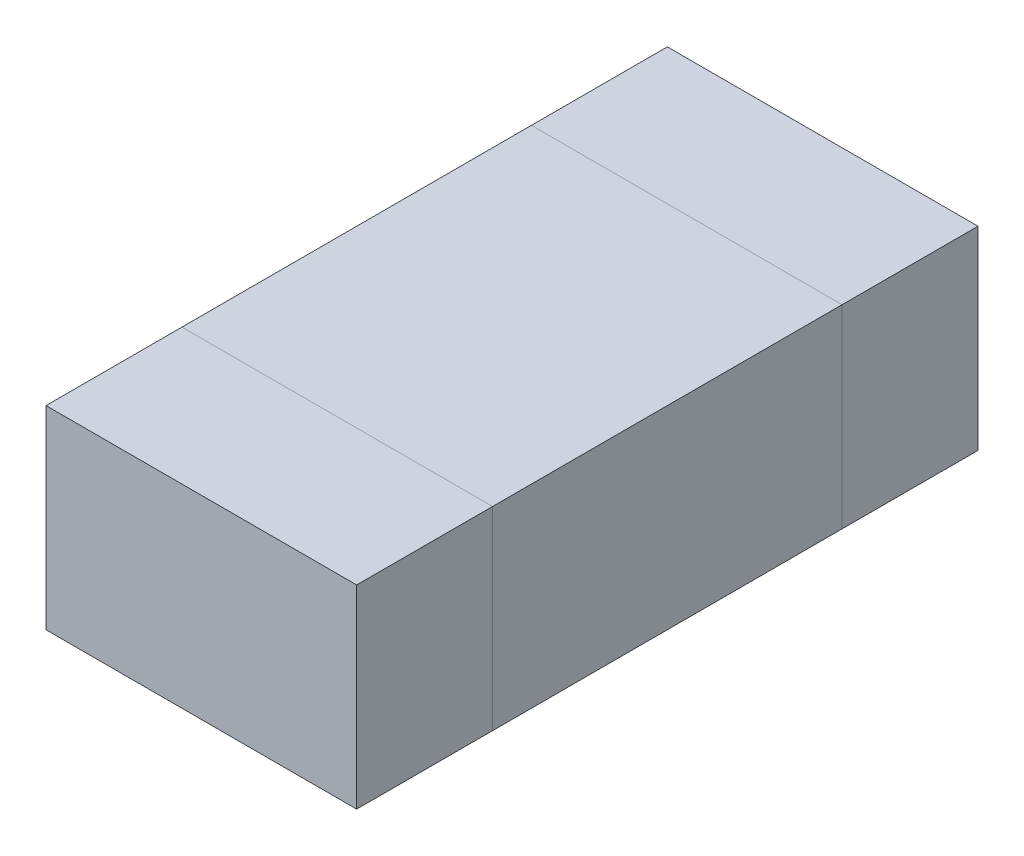
ISO-10303-21;
HEADER;
FILE_DESCRIPTION(('STEP AP214'),'2;1');
FILE_NAME('part.step','',(''),(''),'','','');
FILE_SCHEMA(('AUTOMOTIVE_DESIGN { 1 0 10303 214 1 1 1 1 }'));
ENDSEC;
DATA;
#1=APPLICATION_CONTEXT('core data for automotive mechanical design processes');
#2=APPLICATION_PROTOCOL_DEFINITION('international standard','automotive_design',2000,#1);
#3=PRODUCT_CONTEXT('',#1,'mechanical');
#4=PRODUCT('Part','Part','',(#3));
#5=PRODUCT_RELATED_PRODUCT_CATEGORY('part','',(#4));
#6=PRODUCT_DEFINITION_FORMATION('','',#4);
#7=PRODUCT_DEFINITION_CONTEXT('part definition',#1,'design');
#8=PRODUCT_DEFINITION('design','',#6,#7);
#9=PRODUCT_DEFINITION_SHAPE('','',#8);
#10=(LENGTH_UNIT() NAMED_UNIT(*) SI_UNIT(.MILLI.,.METRE.));
#11=(NAMED_UNIT(*) PLANE_ANGLE_UNIT() SI_UNIT($,.RADIAN.));
#12=(NAMED_UNIT(*) SI_UNIT($,.STERADIAN.) SOLID_ANGLE_UNIT());
#13=UNCERTAINTY_MEASURE_WITH_UNIT(LENGTH_MEASURE(1.E-05),#10,'distance_accuracy_value','');
#14=(GEOMETRIC_REPRESENTATION_CONTEXT(3) GLOBAL_UNCERTAINTY_ASSIGNED_CONTEXT((#13)) GLOBAL_UNIT_ASSIGNED_CONTEXT((#10,
#11,#12)) REPRESENTATION_CONTEXT('',''));
#15=CARTESIAN_POINT('',(0.,0.,0.));
#16=DIRECTION('',(0.,0.,1.));
#17=DIRECTION('',(1.,0.,0.));
#18=AXIS2_PLACEMENT_3D('',#15,#16,#17);
#19=CARTESIAN_POINT('',(0.8,1.,-1.6));
#20=DIRECTION('',(-1.,0.,0.));
#21=DIRECTION('',(0.,0.,1.));
#22=AXIS2_PLACEMENT_3D('',#19,#20,#21);
#23=PLANE('',#22);
#24=DIRECTION('',(0.,-1.,0.));
#25=VECTOR('',#24,1.);
#26=CARTESIAN_POINT('',(0.8,1.,-0.9));
#27=LINE('',#26,#25);
#28=CARTESIAN_POINT('',(0.8,1.,-0.9));
#29=VERTEX_POINT('',#28);
#30=CARTESIAN_POINT('',(0.8,0.,-0.9));
#31=VERTEX_POINT('',#30);
#32=EDGE_CURVE('E107',#29,#31,#27,.T.);
#33=ORIENTED_EDGE('',*,*,#32,.T.);
#34=DIRECTION('',(0.,0.,1.));
#35=VECTOR('',#34,1.);
#36=CARTESIAN_POINT('',(0.8,0.,-1.6));
#37=LINE('',#36,#35);
#38=CARTESIAN_POINT('',(0.8,0.,-1.6));
#39=VERTEX_POINT('',#38);
#40=EDGE_CURVE('E12',#39,#31,#37,.T.);
#41=ORIENTED_EDGE('',*,*,#40,.F.);
#42=DIRECTION('',(0.,-1.,0.));
#43=VECTOR('',#42,1.);
#44=CARTESIAN_POINT('',(0.8,1.,-1.6));
#45=LINE('',#44,#43);
#46=CARTESIAN_POINT('',(0.8,1.,-1.6));
#47=VERTEX_POINT('',#46);
#48=EDGE_CURVE('E95',#47,#39,#45,.T.);
#49=ORIENTED_EDGE('',*,*,#48,.F.);
#50=DIRECTION('',(0.,0.,1.));
#51=VECTOR('',#50,1.);
#52=CARTESIAN_POINT('',(0.8,1.,-1.6));
#53=LINE('',#52,#51);
#54=EDGE_CURVE('E103',#47,#29,#53,.T.);
#55=ORIENTED_EDGE('',*,*,#54,.T.);
#56=EDGE_LOOP('',(#33,#41,#49,#55));
#57=FACE_BOUND('',#56,.T.);
#58=ADVANCED_FACE('F44',(#57),#23,.F.);
#59=CARTESIAN_POINT('',(0.8,0.,-1.6));
#60=DIRECTION('',(0.,1.,0.));
#61=DIRECTION('',(0.,0.,1.));
#62=AXIS2_PLACEMENT_3D('',#59,#60,#61);
#63=PLANE('',#62);
#64=DIRECTION('',(-1.,0.,0.));
#65=VECTOR('',#64,1.);
#66=CARTESIAN_POINT('',(0.8,0.,-0.9));
#67=LINE('',#66,#65);
#68=CARTESIAN_POINT('',(-0.8,0.,-0.9));
#69=VERTEX_POINT('',#68);
#70=EDGE_CURVE('E99',#31,#69,#67,.T.);
#71=ORIENTED_EDGE('',*,*,#70,.T.);
#72=DIRECTION('',(0.,0.,1.));
#73=VECTOR('',#72,1.);
#74=CARTESIAN_POINT('',(-0.8,0.,-1.6));
#75=LINE('',#74,#73);
#76=CARTESIAN_POINT('',(-0.8,0.,-1.6));
#77=VERTEX_POINT('',#76);
#78=EDGE_CURVE('E52',#77,#69,#75,.T.);
#79=ORIENTED_EDGE('',*,*,#78,.F.);
#80=DIRECTION('',(-1.,0.,0.));
#81=VECTOR('',#80,1.);
#82=CARTESIAN_POINT('',(0.8,0.,-1.6));
#83=LINE('',#82,#81);
#84=EDGE_CURVE('E90',#39,#77,#83,.T.);
#85=ORIENTED_EDGE('',*,*,#84,.F.);
#86=ORIENTED_EDGE('',*,*,#40,.T.);
#87=EDGE_LOOP('',(#71,#79,#85,#86));
#88=FACE_BOUND('',#87,.T.);
#89=ADVANCED_FACE('F98',(#88),#63,.F.);
#90=CARTESIAN_POINT('',(-0.8,0.,-1.6));
#91=DIRECTION('',(1.,0.,0.));
#92=DIRECTION('',(0.,0.,-1.));
#93=AXIS2_PLACEMENT_3D('',#90,#91,#92);
#94=PLANE('',#93);
#95=DIRECTION('',(0.,1.,0.));
#96=VECTOR('',#95,1.);
#97=CARTESIAN_POINT('',(-0.8,0.,-0.9));
#98=LINE('',#97,#96);
#99=CARTESIAN_POINT('',(-0.8,1.,-0.9));
#100=VERTEX_POINT('',#99);
#101=EDGE_CURVE('E77',#69,#100,#98,.T.);
#102=ORIENTED_EDGE('',*,*,#101,.T.);
#103=DIRECTION('',(0.,0.,1.));
#104=VECTOR('',#103,1.);
#105=CARTESIAN_POINT('',(-0.8,1.,-1.6));
#106=LINE('',#105,#104);
#107=CARTESIAN_POINT('',(-0.8,1.,-1.6));
#108=VERTEX_POINT('',#107);
#109=EDGE_CURVE('E100',#108,#100,#106,.T.);
#110=ORIENTED_EDGE('',*,*,#109,.F.);
#111=DIRECTION('',(0.,1.,0.));
#112=VECTOR('',#111,1.);
#113=CARTESIAN_POINT('',(-0.8,0.,-1.6));
#114=LINE('',#113,#112);
#115=EDGE_CURVE('E93',#77,#108,#114,.T.);
#116=ORIENTED_EDGE('',*,*,#115,.F.);
#117=ORIENTED_EDGE('',*,*,#78,.T.);
#118=EDGE_LOOP('',(#102,#110,#116,#117));
#119=FACE_BOUND('',#118,.T.);
#120=ADVANCED_FACE('F101',(#119),#94,.F.);
#121=CARTESIAN_POINT('',(-0.8,1.,-1.6));
#122=DIRECTION('',(0.,-1.,0.));
#123=DIRECTION('',(0.,0.,-1.));
#124=AXIS2_PLACEMENT_3D('',#121,#122,#123);
#125=PLANE('',#124);
#126=DIRECTION('',(1.,0.,0.));
#127=VECTOR('',#126,1.);
#128=CARTESIAN_POINT('',(-0.8,1.,-0.9));
#129=LINE('',#128,#127);
#130=EDGE_CURVE('E83',#100,#29,#129,.T.);
#131=ORIENTED_EDGE('',*,*,#130,.T.);
#132=ORIENTED_EDGE('',*,*,#54,.F.);
#133=DIRECTION('',(1.,0.,0.));
#134=VECTOR('',#133,1.);
#135=CARTESIAN_POINT('',(-0.8,1.,-1.6));
#136=LINE('',#135,#134);
#137=EDGE_CURVE('E60',#108,#47,#136,.T.);
#138=ORIENTED_EDGE('',*,*,#137,.F.);
#139=ORIENTED_EDGE('',*,*,#109,.T.);
#140=EDGE_LOOP('',(#131,#132,#138,#139));
#141=FACE_BOUND('',#140,.T.);
#142=ADVANCED_FACE('F114',(#141),#125,.F.);
#143=CARTESIAN_POINT('',(0.,0.,-1.6));
#144=DIRECTION('',(0.,0.,-1.));
#145=DIRECTION('',(-1.,0.,0.));
#146=AXIS2_PLACEMENT_3D('',#143,#144,#145);
#147=PLANE('',#146);
#148=ORIENTED_EDGE('',*,*,#48,.T.);
#149=ORIENTED_EDGE('',*,*,#84,.T.);
#150=ORIENTED_EDGE('',*,*,#115,.T.);
#151=ORIENTED_EDGE('',*,*,#137,.T.);
#152=EDGE_LOOP('',(#148,#149,#150,#151));
#153=FACE_BOUND('',#152,.T.);
#154=ADVANCED_FACE('F91',(#153),#147,.T.);
#155=CARTESIAN_POINT('',(0.,0.,-0.9));
#156=DIRECTION('',(0.,0.,-1.));
#157=DIRECTION('',(-1.,0.,0.));
#158=AXIS2_PLACEMENT_3D('',#155,#156,#157);
#159=PLANE('',#158);
#160=ORIENTED_EDGE('',*,*,#32,.F.);
#161=ORIENTED_EDGE('',*,*,#130,.F.);
#162=ORIENTED_EDGE('',*,*,#101,.F.);
#163=ORIENTED_EDGE('',*,*,#70,.F.);
#164=EDGE_LOOP('',(#160,#161,#162,#163));
#165=FACE_BOUND('',#164,.T.);
#166=ADVANCED_FACE('F117',(#165),#159,.F.);
#167=CLOSED_SHELL('',(#58,#89,#120,#142,#154,#166));
#168=MANIFOLD_SOLID_BREP('B2',#167);
#169=CARTESIAN_POINT('',(-0.8,1.,1.6));
#170=DIRECTION('',(1.,0.,0.));
#171=DIRECTION('',(0.,0.,-1.));
#172=AXIS2_PLACEMENT_3D('',#169,#170,#171);
#173=PLANE('',#172);
#174=DIRECTION('',(0.,-1.,0.));
#175=VECTOR('',#174,1.);
#176=CARTESIAN_POINT('',(-0.8,1.,0.9));
#177=LINE('',#176,#175);
#178=CARTESIAN_POINT('',(-0.8,1.,0.9));
#179=VERTEX_POINT('',#178);
#180=CARTESIAN_POINT('',(-0.8,0.,0.9));
#181=VERTEX_POINT('',#180);
#182=EDGE_CURVE('E240',#179,#181,#177,.T.);
#183=ORIENTED_EDGE('',*,*,#182,.T.);
#184=DIRECTION('',(0.,0.,-1.));
#185=VECTOR('',#184,1.);
#186=CARTESIAN_POINT('',(-0.8,0.,1.6));
#187=LINE('',#186,#185);
#188=CARTESIAN_POINT('',(-0.8,0.,1.6));
#189=VERTEX_POINT('',#188);
#190=EDGE_CURVE('E42',#189,#181,#187,.T.);
#191=ORIENTED_EDGE('',*,*,#190,.F.);
#192=DIRECTION('',(0.,-1.,0.));
#193=VECTOR('',#192,1.);
#194=CARTESIAN_POINT('',(-0.8,1.,1.6));
#195=LINE('',#194,#193);
#196=CARTESIAN_POINT('',(-0.8,1.,1.6));
#197=VERTEX_POINT('',#196);
#198=EDGE_CURVE('E228',#197,#189,#195,.T.);
#199=ORIENTED_EDGE('',*,*,#198,.F.);
#200=DIRECTION('',(0.,0.,-1.));
#201=VECTOR('',#200,1.);
#202=CARTESIAN_POINT('',(-0.8,1.,1.6));
#203=LINE('',#202,#201);
#204=EDGE_CURVE('E236',#197,#179,#203,.T.);
#205=ORIENTED_EDGE('',*,*,#204,.T.);
#206=EDGE_LOOP('',(#183,#191,#199,#205));
#207=FACE_BOUND('',#206,.T.);
#208=ADVANCED_FACE('F177',(#207),#173,.F.);
#209=CARTESIAN_POINT('',(-0.8,0.,1.6));
#210=DIRECTION('',(0.,1.,0.));
#211=DIRECTION('',(0.,0.,1.));
#212=AXIS2_PLACEMENT_3D('',#209,#210,#211);
#213=PLANE('',#212);
#214=DIRECTION('',(1.,0.,0.));
#215=VECTOR('',#214,1.);
#216=CARTESIAN_POINT('',(-0.8,0.,0.9));
#217=LINE('',#216,#215);
#218=CARTESIAN_POINT('',(0.8,0.,0.9));
#219=VERTEX_POINT('',#218);
#220=EDGE_CURVE('E232',#181,#219,#217,.T.);
#221=ORIENTED_EDGE('',*,*,#220,.T.);
#222=DIRECTION('',(0.,0.,-1.));
#223=VECTOR('',#222,1.);
#224=CARTESIAN_POINT('',(0.8,0.,1.6));
#225=LINE('',#224,#223);
#226=CARTESIAN_POINT('',(0.8,0.,1.6));
#227=VERTEX_POINT('',#226);
#228=EDGE_CURVE('E185',#227,#219,#225,.T.);
#229=ORIENTED_EDGE('',*,*,#228,.F.);
#230=DIRECTION('',(1.,0.,0.));
#231=VECTOR('',#230,1.);
#232=CARTESIAN_POINT('',(-0.8,0.,1.6));
#233=LINE('',#232,#231);
#234=EDGE_CURVE('E223',#189,#227,#233,.T.);
#235=ORIENTED_EDGE('',*,*,#234,.F.);
#236=ORIENTED_EDGE('',*,*,#190,.T.);
#237=EDGE_LOOP('',(#221,#229,#235,#236));
#238=FACE_BOUND('',#237,.T.);
#239=ADVANCED_FACE('F231',(#238),#213,.F.);
#240=CARTESIAN_POINT('',(0.8,0.,1.6));
#241=DIRECTION('',(-1.,0.,0.));
#242=DIRECTION('',(0.,0.,1.));
#243=AXIS2_PLACEMENT_3D('',#240,#241,#242);
#244=PLANE('',#243);
#245=DIRECTION('',(0.,1.,0.));
#246=VECTOR('',#245,1.);
#247=CARTESIAN_POINT('',(0.8,0.,0.9));
#248=LINE('',#247,#246);
#249=CARTESIAN_POINT('',(0.8,1.,0.9));
#250=VERTEX_POINT('',#249);
#251=EDGE_CURVE('E210',#219,#250,#248,.T.);
#252=ORIENTED_EDGE('',*,*,#251,.T.);
#253=DIRECTION('',(0.,0.,-1.));
#254=VECTOR('',#253,1.);
#255=CARTESIAN_POINT('',(0.8,1.,1.6));
#256=LINE('',#255,#254);
#257=CARTESIAN_POINT('',(0.8,1.,1.6));
#258=VERTEX_POINT('',#257);
#259=EDGE_CURVE('E233',#258,#250,#256,.T.);
#260=ORIENTED_EDGE('',*,*,#259,.F.);
#261=DIRECTION('',(0.,1.,0.));
#262=VECTOR('',#261,1.);
#263=CARTESIAN_POINT('',(0.8,0.,1.6));
#264=LINE('',#263,#262);
#265=EDGE_CURVE('E226',#227,#258,#264,.T.);
#266=ORIENTED_EDGE('',*,*,#265,.F.);
#267=ORIENTED_EDGE('',*,*,#228,.T.);
#268=EDGE_LOOP('',(#252,#260,#266,#267));
#269=FACE_BOUND('',#268,.T.);
#270=ADVANCED_FACE('F234',(#269),#244,.F.);
#271=CARTESIAN_POINT('',(0.8,1.,1.6));
#272=DIRECTION('',(0.,-1.,0.));
#273=DIRECTION('',(0.,0.,-1.));
#274=AXIS2_PLACEMENT_3D('',#271,#272,#273);
#275=PLANE('',#274);
#276=DIRECTION('',(-1.,0.,0.));
#277=VECTOR('',#276,1.);
#278=CARTESIAN_POINT('',(0.8,1.,0.9));
#279=LINE('',#278,#277);
#280=EDGE_CURVE('E216',#250,#179,#279,.T.);
#281=ORIENTED_EDGE('',*,*,#280,.T.);
#282=ORIENTED_EDGE('',*,*,#204,.F.);
#283=DIRECTION('',(-1.,0.,0.));
#284=VECTOR('',#283,1.);
#285=CARTESIAN_POINT('',(0.8,1.,1.6));
#286=LINE('',#285,#284);
#287=EDGE_CURVE('E193',#258,#197,#286,.T.);
#288=ORIENTED_EDGE('',*,*,#287,.F.);
#289=ORIENTED_EDGE('',*,*,#259,.T.);
#290=EDGE_LOOP('',(#281,#282,#288,#289));
#291=FACE_BOUND('',#290,.T.);
#292=ADVANCED_FACE('F247',(#291),#275,.F.);
#293=CARTESIAN_POINT('',(0.,0.,1.6));
#294=DIRECTION('',(0.,0.,1.));
#295=DIRECTION('',(1.,0.,0.));
#296=AXIS2_PLACEMENT_3D('',#293,#294,#295);
#297=PLANE('',#296);
#298=ORIENTED_EDGE('',*,*,#198,.T.);
#299=ORIENTED_EDGE('',*,*,#234,.T.);
#300=ORIENTED_EDGE('',*,*,#265,.T.);
#301=ORIENTED_EDGE('',*,*,#287,.T.);
#302=EDGE_LOOP('',(#298,#299,#300,#301));
#303=FACE_BOUND('',#302,.T.);
#304=ADVANCED_FACE('F224',(#303),#297,.T.);
#305=CARTESIAN_POINT('',(0.,0.,0.9));
#306=DIRECTION('',(0.,0.,1.));
#307=DIRECTION('',(1.,0.,0.));
#308=AXIS2_PLACEMENT_3D('',#305,#306,#307);
#309=PLANE('',#308);
#310=ORIENTED_EDGE('',*,*,#182,.F.);
#311=ORIENTED_EDGE('',*,*,#280,.F.);
#312=ORIENTED_EDGE('',*,*,#251,.F.);
#313=ORIENTED_EDGE('',*,*,#220,.F.);
#314=EDGE_LOOP('',(#310,#311,#312,#313));
#315=FACE_BOUND('',#314,.T.);
#316=ADVANCED_FACE('F250',(#315),#309,.F.);
#317=CLOSED_SHELL('',(#208,#239,#270,#292,#304,#316));
#318=MANIFOLD_SOLID_BREP('B6',#317);
#319=CARTESIAN_POINT('',(0.8,1.,-0.9));
#320=DIRECTION('',(-1.,0.,0.));
#321=DIRECTION('',(0.,0.,1.));
#322=AXIS2_PLACEMENT_3D('',#319,#320,#321);
#323=PLANE('',#322);
#324=DIRECTION('',(0.,0.,-1.));
#325=VECTOR('',#324,1.);
#326=CARTESIAN_POINT('',(0.8,0.,-0.9));
#327=LINE('',#326,#325);
#328=CARTESIAN_POINT('',(0.8,0.,0.9));
#329=VERTEX_POINT('',#328);
#330=CARTESIAN_POINT('',(0.8,0.,-0.9));
#331=VERTEX_POINT('',#330);
#332=EDGE_CURVE('E364',#329,#331,#327,.T.);
#333=ORIENTED_EDGE('',*,*,#332,.T.);
#334=DIRECTION('',(0.,-1.,0.));
#335=VECTOR('',#334,1.);
#336=CARTESIAN_POINT('',(0.8,1.,-0.9));
#337=LINE('',#336,#335);
#338=CARTESIAN_POINT('',(0.8,1.,-0.9));
#339=VERTEX_POINT('',#338);
#340=EDGE_CURVE('E175',#339,#331,#337,.T.);
#341=ORIENTED_EDGE('',*,*,#340,.F.);
#342=DIRECTION('',(0.,0.,-1.));
#343=VECTOR('',#342,1.);
#344=CARTESIAN_POINT('',(0.8,1.,-0.9));
#345=LINE('',#344,#343);
#346=CARTESIAN_POINT('',(0.8,1.,0.9));
#347=VERTEX_POINT('',#346);
#348=EDGE_CURVE('E352',#347,#339,#345,.T.);
#349=ORIENTED_EDGE('',*,*,#348,.F.);
#350=DIRECTION('',(0.,-1.,0.));
#351=VECTOR('',#350,1.);
#352=CARTESIAN_POINT('',(0.8,1.,0.9));
#353=LINE('',#352,#351);
#354=EDGE_CURVE('E360',#347,#329,#353,.T.);
#355=ORIENTED_EDGE('',*,*,#354,.T.);
#356=EDGE_LOOP('',(#333,#341,#349,#355));
#357=FACE_BOUND('',#356,.T.);
#358=ADVANCED_FACE('F301',(#357),#323,.F.);
#359=CARTESIAN_POINT('',(-0.8,1.,-0.9));
#360=DIRECTION('',(0.,0.,1.));
#361=DIRECTION('',(1.,0.,0.));
#362=AXIS2_PLACEMENT_3D('',#359,#360,#361);
#363=PLANE('',#362);
#364=DIRECTION('',(-1.,0.,0.));
#365=VECTOR('',#364,1.);
#366=CARTESIAN_POINT('',(-0.8,0.,-0.9));
#367=LINE('',#366,#365);
#368=CARTESIAN_POINT('',(-0.8,0.,-0.9));
#369=VERTEX_POINT('',#368);
#370=EDGE_CURVE('E356',#331,#369,#367,.T.);
#371=ORIENTED_EDGE('',*,*,#370,.T.);
#372=DIRECTION('',(0.,-1.,0.));
#373=VECTOR('',#372,1.);
#374=CARTESIAN_POINT('',(-0.8,1.,-0.9));
#375=LINE('',#374,#373);
#376=CARTESIAN_POINT('',(-0.8,1.,-0.9));
#377=VERTEX_POINT('',#376);
#378=EDGE_CURVE('E309',#377,#369,#375,.T.);
#379=ORIENTED_EDGE('',*,*,#378,.F.);
#380=DIRECTION('',(-1.,0.,0.));
#381=VECTOR('',#380,1.);
#382=CARTESIAN_POINT('',(-0.8,1.,-0.9));
#383=LINE('',#382,#381);
#384=EDGE_CURVE('E347',#339,#377,#383,.T.);
#385=ORIENTED_EDGE('',*,*,#384,.F.);
#386=ORIENTED_EDGE('',*,*,#340,.T.);
#387=EDGE_LOOP('',(#371,#379,#385,#386));
#388=FACE_BOUND('',#387,.T.);
#389=ADVANCED_FACE('F355',(#388),#363,.F.);
#390=CARTESIAN_POINT('',(-0.8,1.,-0.9));
#391=DIRECTION('',(1.,0.,0.));
#392=DIRECTION('',(0.,0.,-1.));
#393=AXIS2_PLACEMENT_3D('',#390,#391,#392);
#394=PLANE('',#393);
#395=DIRECTION('',(0.,0.,1.));
#396=VECTOR('',#395,1.);
#397=CARTESIAN_POINT('',(-0.8,0.,-0.9));
#398=LINE('',#397,#396);
#399=CARTESIAN_POINT('',(-0.8,0.,0.9));
#400=VERTEX_POINT('',#399);
#401=EDGE_CURVE('E334',#369,#400,#398,.T.);
#402=ORIENTED_EDGE('',*,*,#401,.T.);
#403=DIRECTION('',(0.,-1.,0.));
#404=VECTOR('',#403,1.);
#405=CARTESIAN_POINT('',(-0.8,1.,0.9));
#406=LINE('',#405,#404);
#407=CARTESIAN_POINT('',(-0.8,1.,0.9));
#408=VERTEX_POINT('',#407);
#409=EDGE_CURVE('E357',#408,#400,#406,.T.);
#410=ORIENTED_EDGE('',*,*,#409,.F.);
#411=DIRECTION('',(0.,0.,1.));
#412=VECTOR('',#411,1.);
#413=CARTESIAN_POINT('',(-0.8,1.,-0.9));
#414=LINE('',#413,#412);
#415=EDGE_CURVE('E350',#377,#408,#414,.T.);
#416=ORIENTED_EDGE('',*,*,#415,.F.);
#417=ORIENTED_EDGE('',*,*,#378,.T.);
#418=EDGE_LOOP('',(#402,#410,#416,#417));
#419=FACE_BOUND('',#418,.T.);
#420=ADVANCED_FACE('F358',(#419),#394,.F.);
#421=CARTESIAN_POINT('',(-0.8,1.,0.9));
#422=DIRECTION('',(0.,0.,-1.));
#423=DIRECTION('',(-1.,0.,0.));
#424=AXIS2_PLACEMENT_3D('',#421,#422,#423);
#425=PLANE('',#424);
#426=DIRECTION('',(1.,0.,0.));
#427=VECTOR('',#426,1.);
#428=CARTESIAN_POINT('',(-0.8,0.,0.9));
#429=LINE('',#428,#427);
#430=EDGE_CURVE('E340',#400,#329,#429,.T.);
#431=ORIENTED_EDGE('',*,*,#430,.T.);
#432=ORIENTED_EDGE('',*,*,#354,.F.);
#433=DIRECTION('',(1.,0.,0.));
#434=VECTOR('',#433,1.);
#435=CARTESIAN_POINT('',(-0.8,1.,0.9));
#436=LINE('',#435,#434);
#437=EDGE_CURVE('E317',#408,#347,#436,.T.);
#438=ORIENTED_EDGE('',*,*,#437,.F.);
#439=ORIENTED_EDGE('',*,*,#409,.T.);
#440=EDGE_LOOP('',(#431,#432,#438,#439));
#441=FACE_BOUND('',#440,.T.);
#442=ADVANCED_FACE('F371',(#441),#425,.F.);
#443=CARTESIAN_POINT('',(0.,1.,0.));
#444=DIRECTION('',(0.,1.,0.));
#445=DIRECTION('',(0.,0.,1.));
#446=AXIS2_PLACEMENT_3D('',#443,#444,#445);
#447=PLANE('',#446);
#448=ORIENTED_EDGE('',*,*,#348,.T.);
#449=ORIENTED_EDGE('',*,*,#384,.T.);
#450=ORIENTED_EDGE('',*,*,#415,.T.);
#451=ORIENTED_EDGE('',*,*,#437,.T.);
#452=EDGE_LOOP('',(#448,#449,#450,#451));
#453=FACE_BOUND('',#452,.T.);
#454=ADVANCED_FACE('F348',(#453),#447,.T.);
#455=CARTESIAN_POINT('',(0.,0.,0.));
#456=DIRECTION('',(0.,1.,0.));
#457=DIRECTION('',(0.,0.,1.));
#458=AXIS2_PLACEMENT_3D('',#455,#456,#457);
#459=PLANE('',#458);
#460=ORIENTED_EDGE('',*,*,#332,.F.);
#461=ORIENTED_EDGE('',*,*,#430,.F.);
#462=ORIENTED_EDGE('',*,*,#401,.F.);
#463=ORIENTED_EDGE('',*,*,#370,.F.);
#464=EDGE_LOOP('',(#460,#461,#462,#463));
#465=FACE_BOUND('',#464,.T.);
#466=ADVANCED_FACE('F374',(#465),#459,.F.);
#467=CLOSED_SHELL('',(#358,#389,#420,#442,#454,#466));
#468=MANIFOLD_SOLID_BREP('B36',#467);
#469=ADVANCED_BREP_SHAPE_REPRESENTATION('',(#18,#168,#318,#468),#14);
#470=SHAPE_DEFINITION_REPRESENTATION(#9,#469);
ENDSEC;
END-ISO-10303-21;
